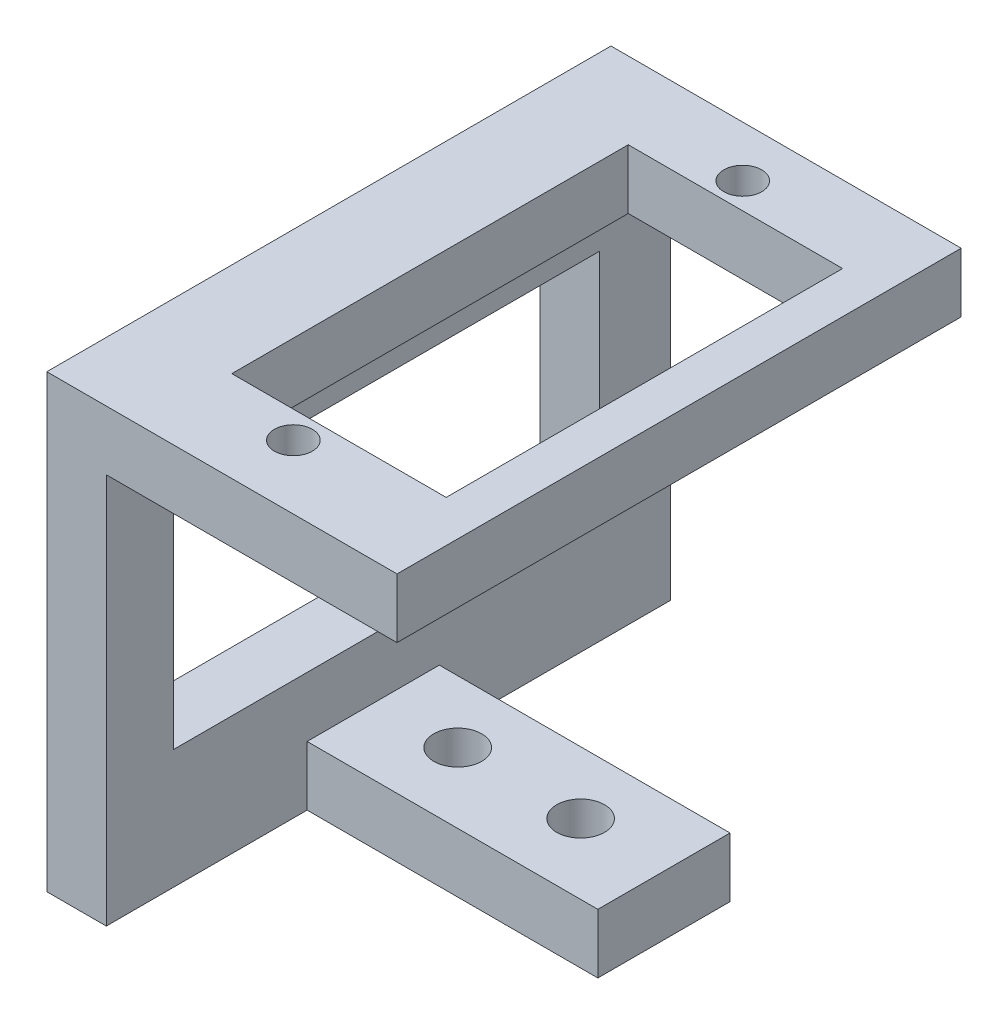
ISO-10303-21;
HEADER;
FILE_DESCRIPTION(('STEP AP214'),'2;1');
FILE_NAME('part.step','',(''),(''),'','','');
FILE_SCHEMA(('AUTOMOTIVE_DESIGN { 1 0 10303 214 1 1 1 1 }'));
ENDSEC;
DATA;
#1=APPLICATION_CONTEXT('core data for automotive mechanical design processes');
#2=APPLICATION_PROTOCOL_DEFINITION('international standard','automotive_design',2000,#1);
#3=PRODUCT_CONTEXT('',#1,'mechanical');
#4=PRODUCT('Part','Part','',(#3));
#5=PRODUCT_RELATED_PRODUCT_CATEGORY('part','',(#4));
#6=PRODUCT_DEFINITION_FORMATION('','',#4);
#7=PRODUCT_DEFINITION_CONTEXT('part definition',#1,'design');
#8=PRODUCT_DEFINITION('design','',#6,#7);
#9=PRODUCT_DEFINITION_SHAPE('','',#8);
#10=(LENGTH_UNIT() NAMED_UNIT(*) SI_UNIT(.MILLI.,.METRE.));
#11=(NAMED_UNIT(*) PLANE_ANGLE_UNIT() SI_UNIT($,.RADIAN.));
#12=(NAMED_UNIT(*) SI_UNIT($,.STERADIAN.) SOLID_ANGLE_UNIT());
#13=UNCERTAINTY_MEASURE_WITH_UNIT(LENGTH_MEASURE(1.E-05),#10,'distance_accuracy_value','');
#14=(GEOMETRIC_REPRESENTATION_CONTEXT(3) GLOBAL_UNCERTAINTY_ASSIGNED_CONTEXT((#13)) GLOBAL_UNIT_ASSIGNED_CONTEXT((#10,
#11,#12)) REPRESENTATION_CONTEXT('',''));
#15=CARTESIAN_POINT('',(0.,0.,0.));
#16=DIRECTION('',(0.,0.,1.));
#17=DIRECTION('',(1.,0.,0.));
#18=AXIS2_PLACEMENT_3D('',#15,#16,#17);
#19=CARTESIAN_POINT('',(0.,3.60195112639479,-34.1540558855455));
#20=DIRECTION('',(0.,1.,0.));
#21=DIRECTION('',(0.,0.,1.));
#22=AXIS2_PLACEMENT_3D('',#19,#20,#21);
#23=PLANE('',#22);
#24=CARTESIAN_POINT('',(7.45297289271455,3.60195112639479,-31.0775457076673));
#25=DIRECTION('',(0.,1.,0.));
#26=DIRECTION('',(0.,0.,1.));
#27=AXIS2_PLACEMENT_3D('',#24,#25,#26);
#28=CIRCLE('',#27,1.15);
#29=CARTESIAN_POINT('',(7.45297289271455,3.60195112639479,-29.9275457076673));
#30=VERTEX_POINT('',#29);
#31=EDGE_CURVE('E271',#30,#30,#28,.F.);
#32=ORIENTED_EDGE('',*,*,#31,.T.);
#33=EDGE_LOOP('',(#32));
#34=FACE_BOUND('',#33,.T.);
#35=DIRECTION('',(1.,0.,0.));
#36=VECTOR('',#35,1.);
#37=CARTESIAN_POINT('',(0.,3.60195112639479,0.));
#38=LINE('',#37,#36);
#39=CARTESIAN_POINT('',(17.6,3.60195112639479,0.));
#40=VERTEX_POINT('',#39);
#41=CARTESIAN_POINT('',(-3.60195112639479,3.60195112639479,0.));
#42=VERTEX_POINT('',#41);
#43=EDGE_CURVE('E305',#40,#42,#38,.F.);
#44=ORIENTED_EDGE('',*,*,#43,.F.);
#45=DIRECTION('',(0.,0.,1.));
#46=VECTOR('',#45,1.);
#47=CARTESIAN_POINT('',(17.6,3.60195112639479,-34.1540558855455));
#48=LINE('',#47,#46);
#49=CARTESIAN_POINT('',(17.6,3.60195112639479,-34.1540558855455));
#50=VERTEX_POINT('',#49);
#51=EDGE_CURVE('E311',#50,#40,#48,.T.);
#52=ORIENTED_EDGE('',*,*,#51,.F.);
#53=DIRECTION('',(1.,0.,0.));
#54=VECTOR('',#53,1.);
#55=CARTESIAN_POINT('',(0.,3.60195112639479,-34.1540558855455));
#56=LINE('',#55,#54);
#57=CARTESIAN_POINT('',(-3.60195112639479,3.60195112639479,-34.1540558855455));
#58=VERTEX_POINT('',#57);
#59=EDGE_CURVE('E288',#50,#58,#56,.F.);
#60=ORIENTED_EDGE('',*,*,#59,.T.);
#61=DIRECTION('',(0.,0.,1.));
#62=VECTOR('',#61,1.);
#63=CARTESIAN_POINT('',(-3.60195112639479,3.60195112639479,-34.1540558855455));
#64=LINE('',#63,#62);
#65=EDGE_CURVE('E48',#58,#42,#64,.T.);
#66=ORIENTED_EDGE('',*,*,#65,.T.);
#67=EDGE_LOOP('',(#44,#52,#60,#66));
#68=FACE_BOUND('',#67,.T.);
#69=DIRECTION('',(-1.,0.,0.));
#70=VECTOR('',#69,1.);
#71=CARTESIAN_POINT('',(0.,3.60195112639479,-5.5));
#72=LINE('',#71,#70);
#73=CARTESIAN_POINT('',(15.0763328763303,3.60195112639479,-5.5));
#74=VERTEX_POINT('',#73);
#75=CARTESIAN_POINT('',(2.09804887360522,3.60195112639479,-5.5));
#76=VERTEX_POINT('',#75);
#77=EDGE_CURVE('E265',#74,#76,#72,.T.);
#78=ORIENTED_EDGE('',*,*,#77,.T.);
#79=DIRECTION('',(0.,0.,-1.));
#80=VECTOR('',#79,1.);
#81=CARTESIAN_POINT('',(2.09804887360521,3.60195112639479,-34.1540558855455));
#82=LINE('',#81,#80);
#83=CARTESIAN_POINT('',(2.09804887360521,3.60195112639479,-29.5));
#84=VERTEX_POINT('',#83);
#85=EDGE_CURVE('E268',#76,#84,#82,.T.);
#86=ORIENTED_EDGE('',*,*,#85,.T.);
#87=DIRECTION('',(1.,0.,0.));
#88=VECTOR('',#87,1.);
#89=CARTESIAN_POINT('',(0.,3.60195112639479,-29.5));
#90=LINE('',#89,#88);
#91=CARTESIAN_POINT('',(15.0763328763303,3.60195112639479,-29.5));
#92=VERTEX_POINT('',#91);
#93=EDGE_CURVE('E259',#84,#92,#90,.T.);
#94=ORIENTED_EDGE('',*,*,#93,.T.);
#95=DIRECTION('',(0.,0.,1.));
#96=VECTOR('',#95,1.);
#97=CARTESIAN_POINT('',(15.0763328763303,3.60195112639479,-34.1540558855455));
#98=LINE('',#97,#96);
#99=EDGE_CURVE('E262',#92,#74,#98,.T.);
#100=ORIENTED_EDGE('',*,*,#99,.T.);
#101=EDGE_LOOP('',(#78,#86,#94,#100));
#102=FACE_BOUND('',#101,.T.);
#103=CARTESIAN_POINT('',(7.45297289271455,3.60195112639479,-3.87061670159561));
#104=DIRECTION('',(0.,1.,0.));
#105=DIRECTION('',(0.,0.,1.));
#106=AXIS2_PLACEMENT_3D('',#103,#104,#105);
#107=CIRCLE('',#106,1.15);
#108=CARTESIAN_POINT('',(7.45297289271455,3.60195112639479,-2.72061670159561));
#109=VERTEX_POINT('',#108);
#110=EDGE_CURVE('E274',#109,#109,#107,.F.);
#111=ORIENTED_EDGE('',*,*,#110,.T.);
#112=EDGE_LOOP('',(#111));
#113=FACE_BOUND('',#112,.T.);
#114=ADVANCED_FACE('F39',(#34,#68,#102,#113),#23,.T.);
#115=CARTESIAN_POINT('',(0.,0.,-34.1540558855455));
#116=DIRECTION('',(0.,1.,0.));
#117=DIRECTION('',(0.,0.,1.));
#118=AXIS2_PLACEMENT_3D('',#115,#116,#117);
#119=PLANE('',#118);
#120=DIRECTION('',(0.,0.,1.));
#121=VECTOR('',#120,1.);
#122=CARTESIAN_POINT('',(2.09804887360521,0.,-29.5));
#123=LINE('',#122,#121);
#124=CARTESIAN_POINT('',(2.09804887360521,0.,-29.5));
#125=VERTEX_POINT('',#124);
#126=CARTESIAN_POINT('',(2.09804887360522,0.,-5.5));
#127=VERTEX_POINT('',#126);
#128=EDGE_CURVE('E236',#125,#127,#123,.T.);
#129=ORIENTED_EDGE('',*,*,#128,.T.);
#130=DIRECTION('',(1.,0.,0.));
#131=VECTOR('',#130,1.);
#132=CARTESIAN_POINT('',(2.09804887360522,0.,-5.5));
#133=LINE('',#132,#131);
#134=CARTESIAN_POINT('',(15.0763328763303,0.,-5.5));
#135=VERTEX_POINT('',#134);
#136=EDGE_CURVE('E240',#127,#135,#133,.T.);
#137=ORIENTED_EDGE('',*,*,#136,.T.);
#138=DIRECTION('',(0.,0.,-1.));
#139=VECTOR('',#138,1.);
#140=CARTESIAN_POINT('',(15.0763328763303,0.,-29.5));
#141=LINE('',#140,#139);
#142=CARTESIAN_POINT('',(15.0763328763303,0.,-29.5));
#143=VERTEX_POINT('',#142);
#144=EDGE_CURVE('E243',#135,#143,#141,.T.);
#145=ORIENTED_EDGE('',*,*,#144,.T.);
#146=DIRECTION('',(-1.,0.,0.));
#147=VECTOR('',#146,1.);
#148=CARTESIAN_POINT('',(2.09804887360521,0.,-29.5));
#149=LINE('',#148,#147);
#150=EDGE_CURVE('E245',#143,#125,#149,.T.);
#151=ORIENTED_EDGE('',*,*,#150,.T.);
#152=EDGE_LOOP('',(#129,#137,#145,#151));
#153=FACE_BOUND('',#152,.T.);
#154=DIRECTION('',(-1.,0.,0.));
#155=VECTOR('',#154,1.);
#156=CARTESIAN_POINT('',(0.,0.,0.));
#157=LINE('',#156,#155);
#158=CARTESIAN_POINT('',(17.6,0.,0.));
#159=VERTEX_POINT('',#158);
#160=CARTESIAN_POINT('',(0.,0.,0.));
#161=VERTEX_POINT('',#160);
#162=EDGE_CURVE('E299',#159,#161,#157,.T.);
#163=ORIENTED_EDGE('',*,*,#162,.T.);
#164=DIRECTION('',(0.,0.,1.));
#165=VECTOR('',#164,1.);
#166=CARTESIAN_POINT('',(0.,0.,-34.1540558855455));
#167=LINE('',#166,#165);
#168=CARTESIAN_POINT('',(0.,0.,-34.1540558855455));
#169=VERTEX_POINT('',#168);
#170=EDGE_CURVE('E315',#169,#161,#167,.T.);
#171=ORIENTED_EDGE('',*,*,#170,.F.);
#172=DIRECTION('',(-1.,0.,0.));
#173=VECTOR('',#172,1.);
#174=CARTESIAN_POINT('',(0.,0.,-34.1540558855455));
#175=LINE('',#174,#173);
#176=CARTESIAN_POINT('',(17.6,0.,-34.1540558855455));
#177=VERTEX_POINT('',#176);
#178=EDGE_CURVE('E284',#177,#169,#175,.T.);
#179=ORIENTED_EDGE('',*,*,#178,.F.);
#180=DIRECTION('',(0.,0.,1.));
#181=VECTOR('',#180,1.);
#182=CARTESIAN_POINT('',(17.6,0.,-34.1540558855455));
#183=LINE('',#182,#181);
#184=EDGE_CURVE('E313',#177,#159,#183,.T.);
#185=ORIENTED_EDGE('',*,*,#184,.T.);
#186=EDGE_LOOP('',(#163,#171,#179,#185));
#187=FACE_BOUND('',#186,.T.);
#188=CARTESIAN_POINT('',(7.45297289271455,0.,-3.87061670159561));
#189=DIRECTION('',(0.,1.,0.));
#190=DIRECTION('',(0.,0.,1.));
#191=AXIS2_PLACEMENT_3D('',#188,#189,#190);
#192=CIRCLE('',#191,1.15);
#193=CARTESIAN_POINT('',(7.45297289271455,0.,-2.72061670159561));
#194=VERTEX_POINT('',#193);
#195=EDGE_CURVE('E232',#194,#194,#192,.T.);
#196=ORIENTED_EDGE('',*,*,#195,.T.);
#197=EDGE_LOOP('',(#196));
#198=FACE_BOUND('',#197,.T.);
#199=CARTESIAN_POINT('',(7.45297289271455,0.,-31.0775457076673));
#200=DIRECTION('',(0.,1.,0.));
#201=DIRECTION('',(0.,0.,1.));
#202=AXIS2_PLACEMENT_3D('',#199,#200,#201);
#203=CIRCLE('',#202,1.15);
#204=CARTESIAN_POINT('',(7.45297289271455,0.,-29.9275457076673));
#205=VERTEX_POINT('',#204);
#206=EDGE_CURVE('E233',#205,#205,#203,.T.);
#207=ORIENTED_EDGE('',*,*,#206,.T.);
#208=EDGE_LOOP('',(#207));
#209=FACE_BOUND('',#208,.T.);
#210=ADVANCED_FACE('F348',(#153,#187,#198,#209),#119,.F.);
#211=CARTESIAN_POINT('',(0.,-23.6622535263948,-34.1540558855455));
#212=DIRECTION('',(0.,-1.,0.));
#213=DIRECTION('',(0.,0.,-1.));
#214=AXIS2_PLACEMENT_3D('',#211,#212,#213);
#215=PLANE('',#214);
#216=CARTESIAN_POINT('',(4.88038915753873,-23.6622535263948,-16.39435657501));
#217=DIRECTION('',(0.,-1.,0.));
#218=DIRECTION('',(0.,0.,-1.));
#219=AXIS2_PLACEMENT_3D('',#216,#217,#218);
#220=CIRCLE('',#219,1.45);
#221=CARTESIAN_POINT('',(4.88038915753873,-23.6622535263948,-17.84435657501));
#222=VERTEX_POINT('',#221);
#223=EDGE_CURVE('E204',#222,#222,#220,.T.);
#224=ORIENTED_EDGE('',*,*,#223,.F.);
#225=EDGE_LOOP('',(#224));
#226=FACE_BOUND('',#225,.T.);
#227=CARTESIAN_POINT('',(12.3191530269541,-23.6622535263948,-16.39435657501));
#228=DIRECTION('',(0.,-1.,0.));
#229=DIRECTION('',(0.,0.,-1.));
#230=AXIS2_PLACEMENT_3D('',#227,#228,#229);
#231=CIRCLE('',#230,1.45);
#232=CARTESIAN_POINT('',(12.3191530269541,-23.6622535263948,-17.84435657501));
#233=VERTEX_POINT('',#232);
#234=EDGE_CURVE('E201',#233,#233,#231,.T.);
#235=ORIENTED_EDGE('',*,*,#234,.F.);
#236=EDGE_LOOP('',(#235));
#237=FACE_BOUND('',#236,.T.);
#238=DIRECTION('',(0.,0.,-1.));
#239=VECTOR('',#238,1.);
#240=CARTESIAN_POINT('',(0.,-23.6622535263948,-34.1540558855455));
#241=LINE('',#240,#239);
#242=CARTESIAN_POINT('',(0.,-23.6622535263948,-20.1608192937013));
#243=VERTEX_POINT('',#242);
#244=CARTESIAN_POINT('',(0.,-23.6622535263948,-34.1540558855455));
#245=VERTEX_POINT('',#244);
#246=EDGE_CURVE('E219',#243,#245,#241,.T.);
#247=ORIENTED_EDGE('',*,*,#246,.F.);
#248=DIRECTION('',(-1.,0.,0.));
#249=VECTOR('',#248,1.);
#250=CARTESIAN_POINT('',(0.,-23.6622535263948,-20.1608192937013));
#251=LINE('',#250,#249);
#252=CARTESIAN_POINT('',(17.6,-23.6622535263948,-20.1608192937013));
#253=VERTEX_POINT('',#252);
#254=EDGE_CURVE('E230',#253,#243,#251,.T.);
#255=ORIENTED_EDGE('',*,*,#254,.F.);
#256=DIRECTION('',(0.,0.,1.));
#257=VECTOR('',#256,1.);
#258=CARTESIAN_POINT('',(17.6,-23.6622535263948,-34.1540558855455));
#259=LINE('',#258,#257);
#260=CARTESIAN_POINT('',(17.6,-23.6622535263948,-12.1570860164823));
#261=VERTEX_POINT('',#260);
#262=EDGE_CURVE('E294',#253,#261,#259,.T.);
#263=ORIENTED_EDGE('',*,*,#262,.T.);
#264=DIRECTION('',(1.,0.,0.));
#265=VECTOR('',#264,1.);
#266=CARTESIAN_POINT('',(0.,-23.6622535263948,-12.1570860164823));
#267=LINE('',#266,#265);
#268=CARTESIAN_POINT('',(0.,-23.6622535263948,-12.1570860164823));
#269=VERTEX_POINT('',#268);
#270=EDGE_CURVE('E225',#269,#261,#267,.T.);
#271=ORIENTED_EDGE('',*,*,#270,.F.);
#272=DIRECTION('',(0.,0.,-1.));
#273=VECTOR('',#272,1.);
#274=CARTESIAN_POINT('',(0.,-23.6622535263948,-34.1540558855455));
#275=LINE('',#274,#273);
#276=CARTESIAN_POINT('',(0.,-23.6622535263948,0.));
#277=VERTEX_POINT('',#276);
#278=EDGE_CURVE('E211',#277,#269,#275,.T.);
#279=ORIENTED_EDGE('',*,*,#278,.F.);
#280=DIRECTION('',(1.,0.,0.));
#281=VECTOR('',#280,1.);
#282=CARTESIAN_POINT('',(0.,-23.6622535263948,0.));
#283=LINE('',#282,#281);
#284=CARTESIAN_POINT('',(-3.60195112639479,-23.6622535263948,0.));
#285=VERTEX_POINT('',#284);
#286=EDGE_CURVE('E277',#285,#277,#283,.T.);
#287=ORIENTED_EDGE('',*,*,#286,.F.);
#288=DIRECTION('',(0.,0.,1.));
#289=VECTOR('',#288,1.);
#290=CARTESIAN_POINT('',(-3.60195112639479,-23.6622535263948,-34.1540558855455));
#291=LINE('',#290,#289);
#292=CARTESIAN_POINT('',(-3.60195112639479,-23.6622535263948,-34.1540558855455));
#293=VERTEX_POINT('',#292);
#294=EDGE_CURVE('E11',#293,#285,#291,.T.);
#295=ORIENTED_EDGE('',*,*,#294,.F.);
#296=DIRECTION('',(1.,0.,0.));
#297=VECTOR('',#296,1.);
#298=CARTESIAN_POINT('',(0.,-23.6622535263948,-34.1540558855455));
#299=LINE('',#298,#297);
#300=EDGE_CURVE('E278',#293,#245,#299,.T.);
#301=ORIENTED_EDGE('',*,*,#300,.T.);
#302=EDGE_LOOP('',(#247,#255,#263,#271,#279,#287,#295,#301));
#303=FACE_BOUND('',#302,.T.);
#304=ADVANCED_FACE('F41',(#226,#237,#303),#215,.T.);
#305=CARTESIAN_POINT('',(-3.60195112639479,0.,-34.1540558855455));
#306=DIRECTION('',(-1.,0.,0.));
#307=DIRECTION('',(0.,0.,1.));
#308=AXIS2_PLACEMENT_3D('',#305,#306,#307);
#309=PLANE('',#308);
#310=DIRECTION('',(0.,1.,0.));
#311=VECTOR('',#310,1.);
#312=CARTESIAN_POINT('',(-3.60195112639479,0.,-4.07322639194987));
#313=LINE('',#312,#311);
#314=CARTESIAN_POINT('',(-3.60195112639479,-16.4380938717206,-4.07322639194987));
#315=VERTEX_POINT('',#314);
#316=CARTESIAN_POINT('',(-3.60195112639479,-3.20879287203949,-4.07322639194987));
#317=VERTEX_POINT('',#316);
#318=EDGE_CURVE('E198',#315,#317,#313,.T.);
#319=ORIENTED_EDGE('',*,*,#318,.F.);
#320=DIRECTION('',(0.,0.,1.));
#321=VECTOR('',#320,1.);
#322=CARTESIAN_POINT('',(-3.60195112639479,-16.4380938717206,-34.1540558855455));
#323=LINE('',#322,#321);
#324=CARTESIAN_POINT('',(-3.60195112639479,-16.4380938717206,-29.8553300447375));
#325=VERTEX_POINT('',#324);
#326=EDGE_CURVE('E191',#325,#315,#323,.T.);
#327=ORIENTED_EDGE('',*,*,#326,.F.);
#328=DIRECTION('',(0.,-1.,0.));
#329=VECTOR('',#328,1.);
#330=CARTESIAN_POINT('',(-3.60195112639479,0.,-29.8553300447375));
#331=LINE('',#330,#329);
#332=CARTESIAN_POINT('',(-3.60195112639479,-3.20879287203949,-29.8553300447375));
#333=VERTEX_POINT('',#332);
#334=EDGE_CURVE('E171',#333,#325,#331,.T.);
#335=ORIENTED_EDGE('',*,*,#334,.F.);
#336=DIRECTION('',(0.,0.,-1.));
#337=VECTOR('',#336,1.);
#338=CARTESIAN_POINT('',(-3.60195112639479,-3.20879287203949,-34.1540558855455));
#339=LINE('',#338,#337);
#340=EDGE_CURVE('E196',#317,#333,#339,.T.);
#341=ORIENTED_EDGE('',*,*,#340,.F.);
#342=EDGE_LOOP('',(#319,#327,#335,#341));
#343=FACE_BOUND('',#342,.T.);
#344=DIRECTION('',(0.,1.,0.));
#345=VECTOR('',#344,1.);
#346=CARTESIAN_POINT('',(-3.60195112639479,0.,0.));
#347=LINE('',#346,#345);
#348=EDGE_CURVE('E282',#42,#285,#347,.F.);
#349=ORIENTED_EDGE('',*,*,#348,.F.);
#350=ORIENTED_EDGE('',*,*,#65,.F.);
#351=DIRECTION('',(0.,1.,0.));
#352=VECTOR('',#351,1.);
#353=CARTESIAN_POINT('',(-3.60195112639479,0.,-34.1540558855455));
#354=LINE('',#353,#352);
#355=EDGE_CURVE('E291',#58,#293,#354,.F.);
#356=ORIENTED_EDGE('',*,*,#355,.T.);
#357=ORIENTED_EDGE('',*,*,#294,.T.);
#358=EDGE_LOOP('',(#349,#350,#356,#357));
#359=FACE_BOUND('',#358,.T.);
#360=ADVANCED_FACE('F360',(#343,#359),#309,.T.);
#361=CARTESIAN_POINT('',(17.6,3.60195112639479,-34.1540558855455));
#362=DIRECTION('',(-1.,0.,0.));
#363=DIRECTION('',(0.,0.,1.));
#364=AXIS2_PLACEMENT_3D('',#361,#362,#363);
#365=PLANE('',#364);
#366=DIRECTION('',(0.,-1.,0.));
#367=VECTOR('',#366,1.);
#368=CARTESIAN_POINT('',(17.6,3.60195112639479,0.));
#369=LINE('',#368,#367);
#370=EDGE_CURVE('E302',#40,#159,#369,.T.);
#371=ORIENTED_EDGE('',*,*,#370,.T.);
#372=ORIENTED_EDGE('',*,*,#184,.F.);
#373=DIRECTION('',(0.,-1.,0.));
#374=VECTOR('',#373,1.);
#375=CARTESIAN_POINT('',(17.6,3.60195112639479,-34.1540558855455));
#376=LINE('',#375,#374);
#377=EDGE_CURVE('E286',#50,#177,#376,.T.);
#378=ORIENTED_EDGE('',*,*,#377,.F.);
#379=ORIENTED_EDGE('',*,*,#51,.T.);
#380=EDGE_LOOP('',(#371,#372,#378,#379));
#381=FACE_BOUND('',#380,.T.);
#382=ADVANCED_FACE('F362',(#381),#365,.F.);
#383=CARTESIAN_POINT('',(0.,0.,-34.1540558855455));
#384=DIRECTION('',(-1.,0.,0.));
#385=DIRECTION('',(0.,0.,1.));
#386=AXIS2_PLACEMENT_3D('',#383,#384,#385);
#387=PLANE('',#386);
#388=DIRECTION('',(0.,0.,-1.));
#389=VECTOR('',#388,1.);
#390=CARTESIAN_POINT('',(0.,-16.4380938717206,-4.07322639194987));
#391=LINE('',#390,#389);
#392=CARTESIAN_POINT('',(0.,-16.4380938717206,-4.07322639194987));
#393=VERTEX_POINT('',#392);
#394=CARTESIAN_POINT('',(0.,-16.4380938717206,-29.8553300447375));
#395=VERTEX_POINT('',#394);
#396=EDGE_CURVE('E177',#393,#395,#391,.T.);
#397=ORIENTED_EDGE('',*,*,#396,.F.);
#398=DIRECTION('',(0.,-1.,0.));
#399=VECTOR('',#398,1.);
#400=CARTESIAN_POINT('',(0.,-3.20879287203949,-4.07322639194987));
#401=LINE('',#400,#399);
#402=CARTESIAN_POINT('',(0.,-3.20879287203949,-4.07322639194987));
#403=VERTEX_POINT('',#402);
#404=EDGE_CURVE('E64',#403,#393,#401,.T.);
#405=ORIENTED_EDGE('',*,*,#404,.F.);
#406=DIRECTION('',(0.,0.,1.));
#407=VECTOR('',#406,1.);
#408=CARTESIAN_POINT('',(0.,-3.20879287203949,-4.07322639194987));
#409=LINE('',#408,#407);
#410=CARTESIAN_POINT('',(0.,-3.20879287203949,-29.8553300447375));
#411=VERTEX_POINT('',#410);
#412=EDGE_CURVE('E184',#411,#403,#409,.T.);
#413=ORIENTED_EDGE('',*,*,#412,.F.);
#414=DIRECTION('',(0.,1.,0.));
#415=VECTOR('',#414,1.);
#416=CARTESIAN_POINT('',(0.,-3.20879287203949,-29.8553300447375));
#417=LINE('',#416,#415);
#418=EDGE_CURVE('E168',#395,#411,#417,.T.);
#419=ORIENTED_EDGE('',*,*,#418,.F.);
#420=EDGE_LOOP('',(#397,#405,#413,#419));
#421=FACE_BOUND('',#420,.T.);
#422=DIRECTION('',(0.,0.,1.));
#423=VECTOR('',#422,1.);
#424=CARTESIAN_POINT('',(0.,-20.0603024,-34.1540558855455));
#425=LINE('',#424,#423);
#426=CARTESIAN_POINT('',(0.,-20.0603024,-20.1608192937013));
#427=VERTEX_POINT('',#426);
#428=CARTESIAN_POINT('',(0.,-20.0603024,-12.1570860164823));
#429=VERTEX_POINT('',#428);
#430=EDGE_CURVE('E317',#427,#429,#425,.T.);
#431=ORIENTED_EDGE('',*,*,#430,.F.);
#432=DIRECTION('',(0.,1.,0.));
#433=VECTOR('',#432,1.);
#434=CARTESIAN_POINT('',(0.,-29.,-20.1608192937013));
#435=LINE('',#434,#433);
#436=EDGE_CURVE('E212',#243,#427,#435,.T.);
#437=ORIENTED_EDGE('',*,*,#436,.F.);
#438=ORIENTED_EDGE('',*,*,#246,.T.);
#439=DIRECTION('',(0.,-1.,0.));
#440=VECTOR('',#439,1.);
#441=CARTESIAN_POINT('',(0.,0.,-34.1540558855455));
#442=LINE('',#441,#440);
#443=EDGE_CURVE('E281',#169,#245,#442,.T.);
#444=ORIENTED_EDGE('',*,*,#443,.F.);
#445=ORIENTED_EDGE('',*,*,#170,.T.);
#446=DIRECTION('',(0.,-1.,0.));
#447=VECTOR('',#446,1.);
#448=CARTESIAN_POINT('',(0.,0.,0.));
#449=LINE('',#448,#447);
#450=EDGE_CURVE('E297',#161,#277,#449,.T.);
#451=ORIENTED_EDGE('',*,*,#450,.T.);
#452=ORIENTED_EDGE('',*,*,#278,.T.);
#453=DIRECTION('',(0.,1.,0.));
#454=VECTOR('',#453,1.);
#455=CARTESIAN_POINT('',(0.,-29.,-12.1570860164823));
#456=LINE('',#455,#454);
#457=EDGE_CURVE('E207',#269,#429,#456,.T.);
#458=ORIENTED_EDGE('',*,*,#457,.T.);
#459=EDGE_LOOP('',(#431,#437,#438,#444,#445,#451,#452,#458));
#460=FACE_BOUND('',#459,.T.);
#461=ADVANCED_FACE('F181',(#421,#460),#387,.F.);
#462=CARTESIAN_POINT('',(0.,-20.0603024,-34.1540558855455));
#463=DIRECTION('',(0.,-1.,0.));
#464=DIRECTION('',(0.,0.,-1.));
#465=AXIS2_PLACEMENT_3D('',#462,#463,#464);
#466=PLANE('',#465);
#467=CARTESIAN_POINT('',(4.88038915753873,-20.0603024,-16.39435657501));
#468=DIRECTION('',(0.,-1.,0.));
#469=DIRECTION('',(0.,0.,-1.));
#470=AXIS2_PLACEMENT_3D('',#467,#468,#469);
#471=CIRCLE('',#470,1.45);
#472=CARTESIAN_POINT('',(4.88038915753873,-20.0603024,-17.84435657501));
#473=VERTEX_POINT('',#472);
#474=EDGE_CURVE('E43',#473,#473,#471,.T.);
#475=ORIENTED_EDGE('',*,*,#474,.T.);
#476=EDGE_LOOP('',(#475));
#477=FACE_BOUND('',#476,.T.);
#478=CARTESIAN_POINT('',(12.3191530269541,-20.0603024,-16.39435657501));
#479=DIRECTION('',(0.,-1.,0.));
#480=DIRECTION('',(0.,0.,-1.));
#481=AXIS2_PLACEMENT_3D('',#478,#479,#480);
#482=CIRCLE('',#481,1.45);
#483=CARTESIAN_POINT('',(12.3191530269541,-20.0603024,-17.84435657501));
#484=VERTEX_POINT('',#483);
#485=EDGE_CURVE('E200',#484,#484,#482,.T.);
#486=ORIENTED_EDGE('',*,*,#485,.T.);
#487=EDGE_LOOP('',(#486));
#488=FACE_BOUND('',#487,.T.);
#489=DIRECTION('',(0.,0.,1.));
#490=VECTOR('',#489,1.);
#491=CARTESIAN_POINT('',(17.6,-20.0603024,-34.1540558855455));
#492=LINE('',#491,#490);
#493=CARTESIAN_POINT('',(17.6,-20.0603024,-20.1608192937013));
#494=VERTEX_POINT('',#493);
#495=CARTESIAN_POINT('',(17.6,-20.0603024,-12.1570860164823));
#496=VERTEX_POINT('',#495);
#497=EDGE_CURVE('E320',#494,#496,#492,.T.);
#498=ORIENTED_EDGE('',*,*,#497,.F.);
#499=DIRECTION('',(-1.,0.,0.));
#500=VECTOR('',#499,1.);
#501=CARTESIAN_POINT('',(0.,-20.0603024,-20.1608192937013));
#502=LINE('',#501,#500);
#503=EDGE_CURVE('E227',#494,#427,#502,.T.);
#504=ORIENTED_EDGE('',*,*,#503,.T.);
#505=ORIENTED_EDGE('',*,*,#430,.T.);
#506=DIRECTION('',(1.,0.,0.));
#507=VECTOR('',#506,1.);
#508=CARTESIAN_POINT('',(0.,-20.0603024,-12.1570860164823));
#509=LINE('',#508,#507);
#510=EDGE_CURVE('E222',#429,#496,#509,.T.);
#511=ORIENTED_EDGE('',*,*,#510,.T.);
#512=EDGE_LOOP('',(#498,#504,#505,#511));
#513=FACE_BOUND('',#512,.T.);
#514=ADVANCED_FACE('F327',(#477,#488,#513),#466,.F.);
#515=CARTESIAN_POINT('',(17.6,-20.0603024,-34.1540558855455));
#516=DIRECTION('',(-1.,0.,0.));
#517=DIRECTION('',(0.,0.,1.));
#518=AXIS2_PLACEMENT_3D('',#515,#516,#517);
#519=PLANE('',#518);
#520=ORIENTED_EDGE('',*,*,#262,.F.);
#521=DIRECTION('',(0.,1.,0.));
#522=VECTOR('',#521,1.);
#523=CARTESIAN_POINT('',(17.6,-29.,-20.1608192937013));
#524=LINE('',#523,#522);
#525=EDGE_CURVE('E208',#253,#494,#524,.T.);
#526=ORIENTED_EDGE('',*,*,#525,.T.);
#527=ORIENTED_EDGE('',*,*,#497,.T.);
#528=DIRECTION('',(0.,1.,0.));
#529=VECTOR('',#528,1.);
#530=CARTESIAN_POINT('',(17.6,-29.,-12.1570860164823));
#531=LINE('',#530,#529);
#532=EDGE_CURVE('E214',#261,#496,#531,.T.);
#533=ORIENTED_EDGE('',*,*,#532,.F.);
#534=EDGE_LOOP('',(#520,#526,#527,#533));
#535=FACE_BOUND('',#534,.T.);
#536=ADVANCED_FACE('F368',(#535),#519,.F.);
#537=CARTESIAN_POINT('',(0.,0.,-34.1540558855455));
#538=DIRECTION('',(0.,0.,-1.));
#539=DIRECTION('',(-1.,0.,0.));
#540=AXIS2_PLACEMENT_3D('',#537,#538,#539);
#541=PLANE('',#540);
#542=ORIENTED_EDGE('',*,*,#443,.T.);
#543=ORIENTED_EDGE('',*,*,#300,.F.);
#544=ORIENTED_EDGE('',*,*,#355,.F.);
#545=ORIENTED_EDGE('',*,*,#59,.F.);
#546=ORIENTED_EDGE('',*,*,#377,.T.);
#547=ORIENTED_EDGE('',*,*,#178,.T.);
#548=EDGE_LOOP('',(#542,#543,#544,#545,#546,#547));
#549=FACE_BOUND('',#548,.T.);
#550=ADVANCED_FACE('F371',(#549),#541,.T.);
#551=CARTESIAN_POINT('',(0.,0.,0.));
#552=DIRECTION('',(0.,0.,-1.));
#553=DIRECTION('',(-1.,0.,0.));
#554=AXIS2_PLACEMENT_3D('',#551,#552,#553);
#555=PLANE('',#554);
#556=ORIENTED_EDGE('',*,*,#286,.T.);
#557=ORIENTED_EDGE('',*,*,#450,.F.);
#558=ORIENTED_EDGE('',*,*,#162,.F.);
#559=ORIENTED_EDGE('',*,*,#370,.F.);
#560=ORIENTED_EDGE('',*,*,#43,.T.);
#561=ORIENTED_EDGE('',*,*,#348,.T.);
#562=EDGE_LOOP('',(#556,#557,#558,#559,#560,#561));
#563=FACE_BOUND('',#562,.T.);
#564=ADVANCED_FACE('F376',(#563),#555,.F.);
#565=CARTESIAN_POINT('',(2.09804887360521,8.,-29.5));
#566=DIRECTION('',(1.,0.,0.));
#567=DIRECTION('',(0.,0.,-1.));
#568=AXIS2_PLACEMENT_3D('',#565,#566,#567);
#569=PLANE('',#568);
#570=DIRECTION('',(0.,-1.,0.));
#571=VECTOR('',#570,1.);
#572=CARTESIAN_POINT('',(2.09804887360522,8.,-5.5));
#573=LINE('',#572,#571);
#574=EDGE_CURVE('E256',#76,#127,#573,.T.);
#575=ORIENTED_EDGE('',*,*,#574,.T.);
#576=ORIENTED_EDGE('',*,*,#128,.F.);
#577=DIRECTION('',(0.,-1.,0.));
#578=VECTOR('',#577,1.);
#579=CARTESIAN_POINT('',(2.09804887360521,8.,-29.5));
#580=LINE('',#579,#578);
#581=EDGE_CURVE('E248',#84,#125,#580,.T.);
#582=ORIENTED_EDGE('',*,*,#581,.F.);
#583=ORIENTED_EDGE('',*,*,#85,.F.);
#584=EDGE_LOOP('',(#575,#576,#582,#583));
#585=FACE_BOUND('',#584,.T.);
#586=ADVANCED_FACE('F415',(#585),#569,.T.);
#587=CARTESIAN_POINT('',(2.09804887360522,8.,-5.5));
#588=DIRECTION('',(0.,0.,-1.));
#589=DIRECTION('',(-1.,0.,0.));
#590=AXIS2_PLACEMENT_3D('',#587,#588,#589);
#591=PLANE('',#590);
#592=DIRECTION('',(0.,-1.,0.));
#593=VECTOR('',#592,1.);
#594=CARTESIAN_POINT('',(15.0763328763303,8.,-5.5));
#595=LINE('',#594,#593);
#596=EDGE_CURVE('E254',#74,#135,#595,.T.);
#597=ORIENTED_EDGE('',*,*,#596,.T.);
#598=ORIENTED_EDGE('',*,*,#136,.F.);
#599=ORIENTED_EDGE('',*,*,#574,.F.);
#600=ORIENTED_EDGE('',*,*,#77,.F.);
#601=EDGE_LOOP('',(#597,#598,#599,#600));
#602=FACE_BOUND('',#601,.T.);
#603=ADVANCED_FACE('F412',(#602),#591,.T.);
#604=CARTESIAN_POINT('',(15.0763328763303,8.,-29.5));
#605=DIRECTION('',(-1.,0.,0.));
#606=DIRECTION('',(0.,0.,1.));
#607=AXIS2_PLACEMENT_3D('',#604,#605,#606);
#608=PLANE('',#607);
#609=DIRECTION('',(0.,-1.,0.));
#610=VECTOR('',#609,1.);
#611=CARTESIAN_POINT('',(15.0763328763303,8.,-29.5));
#612=LINE('',#611,#610);
#613=EDGE_CURVE('E251',#92,#143,#612,.T.);
#614=ORIENTED_EDGE('',*,*,#613,.T.);
#615=ORIENTED_EDGE('',*,*,#144,.F.);
#616=ORIENTED_EDGE('',*,*,#596,.F.);
#617=ORIENTED_EDGE('',*,*,#99,.F.);
#618=EDGE_LOOP('',(#614,#615,#616,#617));
#619=FACE_BOUND('',#618,.T.);
#620=ADVANCED_FACE('F409',(#619),#608,.T.);
#621=CARTESIAN_POINT('',(2.09804887360521,8.,-29.5));
#622=DIRECTION('',(0.,0.,1.));
#623=DIRECTION('',(1.,0.,0.));
#624=AXIS2_PLACEMENT_3D('',#621,#622,#623);
#625=PLANE('',#624);
#626=ORIENTED_EDGE('',*,*,#581,.T.);
#627=ORIENTED_EDGE('',*,*,#150,.F.);
#628=ORIENTED_EDGE('',*,*,#613,.F.);
#629=ORIENTED_EDGE('',*,*,#93,.F.);
#630=EDGE_LOOP('',(#626,#627,#628,#629));
#631=FACE_BOUND('',#630,.T.);
#632=ADVANCED_FACE('F404',(#631),#625,.T.);
#633=CARTESIAN_POINT('',(7.45297289271455,8.,-31.0775457076673));
#634=DIRECTION('',(0.,-1.,0.));
#635=DIRECTION('',(0.,0.,-1.));
#636=AXIS2_PLACEMENT_3D('',#633,#634,#635);
#637=CYLINDRICAL_SURFACE('',#636,1.15);
#638=ORIENTED_EDGE('',*,*,#31,.F.);
#639=EDGE_LOOP('',(#638));
#640=FACE_BOUND('',#639,.T.);
#641=ORIENTED_EDGE('',*,*,#206,.F.);
#642=EDGE_LOOP('',(#641));
#643=FACE_BOUND('',#642,.T.);
#644=ADVANCED_FACE('F399',(#640,#643),#637,.F.);
#645=CARTESIAN_POINT('',(7.45297289271455,8.,-3.87061670159561));
#646=DIRECTION('',(0.,-1.,0.));
#647=DIRECTION('',(0.,0.,-1.));
#648=AXIS2_PLACEMENT_3D('',#645,#646,#647);
#649=CYLINDRICAL_SURFACE('',#648,1.15);
#650=ORIENTED_EDGE('',*,*,#110,.F.);
#651=EDGE_LOOP('',(#650));
#652=FACE_BOUND('',#651,.T.);
#653=ORIENTED_EDGE('',*,*,#195,.F.);
#654=EDGE_LOOP('',(#653));
#655=FACE_BOUND('',#654,.T.);
#656=ADVANCED_FACE('F393',(#652,#655),#649,.F.);
#657=CARTESIAN_POINT('',(0.,-29.,-12.1570860164823));
#658=DIRECTION('',(0.,0.,-1.));
#659=DIRECTION('',(-1.,0.,0.));
#660=AXIS2_PLACEMENT_3D('',#657,#658,#659);
#661=PLANE('',#660);
#662=ORIENTED_EDGE('',*,*,#270,.T.);
#663=ORIENTED_EDGE('',*,*,#532,.T.);
#664=ORIENTED_EDGE('',*,*,#510,.F.);
#665=ORIENTED_EDGE('',*,*,#457,.F.);
#666=EDGE_LOOP('',(#662,#663,#664,#665));
#667=FACE_BOUND('',#666,.T.);
#668=ADVANCED_FACE('F344',(#667),#661,.F.);
#669=CARTESIAN_POINT('',(0.,-29.,-20.1608192937013));
#670=DIRECTION('',(0.,0.,1.));
#671=DIRECTION('',(1.,0.,0.));
#672=AXIS2_PLACEMENT_3D('',#669,#670,#671);
#673=PLANE('',#672);
#674=ORIENTED_EDGE('',*,*,#254,.T.);
#675=ORIENTED_EDGE('',*,*,#436,.T.);
#676=ORIENTED_EDGE('',*,*,#503,.F.);
#677=ORIENTED_EDGE('',*,*,#525,.F.);
#678=EDGE_LOOP('',(#674,#675,#676,#677));
#679=FACE_BOUND('',#678,.T.);
#680=ADVANCED_FACE('F333',(#679),#673,.F.);
#681=CARTESIAN_POINT('',(12.3191530269541,-33.,-16.39435657501));
#682=DIRECTION('',(0.,1.,0.));
#683=DIRECTION('',(0.,0.,1.));
#684=AXIS2_PLACEMENT_3D('',#681,#682,#683);
#685=CYLINDRICAL_SURFACE('',#684,1.45);
#686=ORIENTED_EDGE('',*,*,#234,.T.);
#687=EDGE_LOOP('',(#686));
#688=FACE_BOUND('',#687,.T.);
#689=ORIENTED_EDGE('',*,*,#485,.F.);
#690=EDGE_LOOP('',(#689));
#691=FACE_BOUND('',#690,.T.);
#692=ADVANCED_FACE('F330',(#688,#691),#685,.F.);
#693=CARTESIAN_POINT('',(4.88038915753873,-33.,-16.39435657501));
#694=DIRECTION('',(0.,1.,0.));
#695=DIRECTION('',(0.,0.,1.));
#696=AXIS2_PLACEMENT_3D('',#693,#694,#695);
#697=CYLINDRICAL_SURFACE('',#696,1.45);
#698=ORIENTED_EDGE('',*,*,#223,.T.);
#699=EDGE_LOOP('',(#698));
#700=FACE_BOUND('',#699,.T.);
#701=ORIENTED_EDGE('',*,*,#474,.F.);
#702=EDGE_LOOP('',(#701));
#703=FACE_BOUND('',#702,.T.);
#704=ADVANCED_FACE('F332',(#700,#703),#697,.F.);
#705=CARTESIAN_POINT('',(-16.,-3.20879287203949,-4.07322639194987));
#706=DIRECTION('',(0.,0.,1.));
#707=DIRECTION('',(1.,0.,0.));
#708=AXIS2_PLACEMENT_3D('',#705,#706,#707);
#709=PLANE('',#708);
#710=ORIENTED_EDGE('',*,*,#318,.T.);
#711=DIRECTION('',(1.,0.,0.));
#712=VECTOR('',#711,1.);
#713=CARTESIAN_POINT('',(-16.,-3.20879287203949,-4.07322639194987));
#714=LINE('',#713,#712);
#715=EDGE_CURVE('E189',#317,#403,#714,.T.);
#716=ORIENTED_EDGE('',*,*,#715,.T.);
#717=ORIENTED_EDGE('',*,*,#404,.T.);
#718=DIRECTION('',(1.,0.,0.));
#719=VECTOR('',#718,1.);
#720=CARTESIAN_POINT('',(-16.,-16.4380938717206,-4.07322639194987));
#721=LINE('',#720,#719);
#722=EDGE_CURVE('E174',#315,#393,#721,.T.);
#723=ORIENTED_EDGE('',*,*,#722,.F.);
#724=EDGE_LOOP('',(#710,#716,#717,#723));
#725=FACE_BOUND('',#724,.T.);
#726=ADVANCED_FACE('F340',(#725),#709,.F.);
#727=CARTESIAN_POINT('',(-16.,-3.20879287203949,-4.07322639194987));
#728=DIRECTION('',(0.,1.,0.));
#729=DIRECTION('',(0.,0.,1.));
#730=AXIS2_PLACEMENT_3D('',#727,#728,#729);
#731=PLANE('',#730);
#732=ORIENTED_EDGE('',*,*,#340,.T.);
#733=DIRECTION('',(1.,0.,0.));
#734=VECTOR('',#733,1.);
#735=CARTESIAN_POINT('',(-16.,-3.20879287203949,-29.8553300447375));
#736=LINE('',#735,#734);
#737=EDGE_CURVE('E173',#333,#411,#736,.T.);
#738=ORIENTED_EDGE('',*,*,#737,.T.);
#739=ORIENTED_EDGE('',*,*,#412,.T.);
#740=ORIENTED_EDGE('',*,*,#715,.F.);
#741=EDGE_LOOP('',(#732,#738,#739,#740));
#742=FACE_BOUND('',#741,.T.);
#743=ADVANCED_FACE('F450',(#742),#731,.F.);
#744=CARTESIAN_POINT('',(-16.,-3.20879287203949,-29.8553300447375));
#745=DIRECTION('',(0.,0.,-1.));
#746=DIRECTION('',(-1.,0.,0.));
#747=AXIS2_PLACEMENT_3D('',#744,#745,#746);
#748=PLANE('',#747);
#749=ORIENTED_EDGE('',*,*,#334,.T.);
#750=DIRECTION('',(1.,0.,0.));
#751=VECTOR('',#750,1.);
#752=CARTESIAN_POINT('',(-16.,-16.4380938717206,-29.8553300447375));
#753=LINE('',#752,#751);
#754=EDGE_CURVE('E56',#325,#395,#753,.T.);
#755=ORIENTED_EDGE('',*,*,#754,.T.);
#756=ORIENTED_EDGE('',*,*,#418,.T.);
#757=ORIENTED_EDGE('',*,*,#737,.F.);
#758=EDGE_LOOP('',(#749,#755,#756,#757));
#759=FACE_BOUND('',#758,.T.);
#760=ADVANCED_FACE('F165',(#759),#748,.F.);
#761=CARTESIAN_POINT('',(-16.,-16.4380938717206,-4.07322639194987));
#762=DIRECTION('',(0.,-1.,0.));
#763=DIRECTION('',(0.,0.,-1.));
#764=AXIS2_PLACEMENT_3D('',#761,#762,#763);
#765=PLANE('',#764);
#766=ORIENTED_EDGE('',*,*,#326,.T.);
#767=ORIENTED_EDGE('',*,*,#722,.T.);
#768=ORIENTED_EDGE('',*,*,#396,.T.);
#769=ORIENTED_EDGE('',*,*,#754,.F.);
#770=EDGE_LOOP('',(#766,#767,#768,#769));
#771=FACE_BOUND('',#770,.T.);
#772=ADVANCED_FACE('F178',(#771),#765,.F.);
#773=CLOSED_SHELL('',(#114,#210,#304,#360,#382,#461,#514,#536,#550,#564,#586,#603,#620,#632,
#644,#656,#668,#680,#692,#704,#726,#743,#760,#772));
#774=MANIFOLD_SOLID_BREP('B2',#773);
#775=ADVANCED_BREP_SHAPE_REPRESENTATION('',(#18,#774),#14);
#776=SHAPE_DEFINITION_REPRESENTATION(#9,#775);
ENDSEC;
END-ISO-10303-21;
